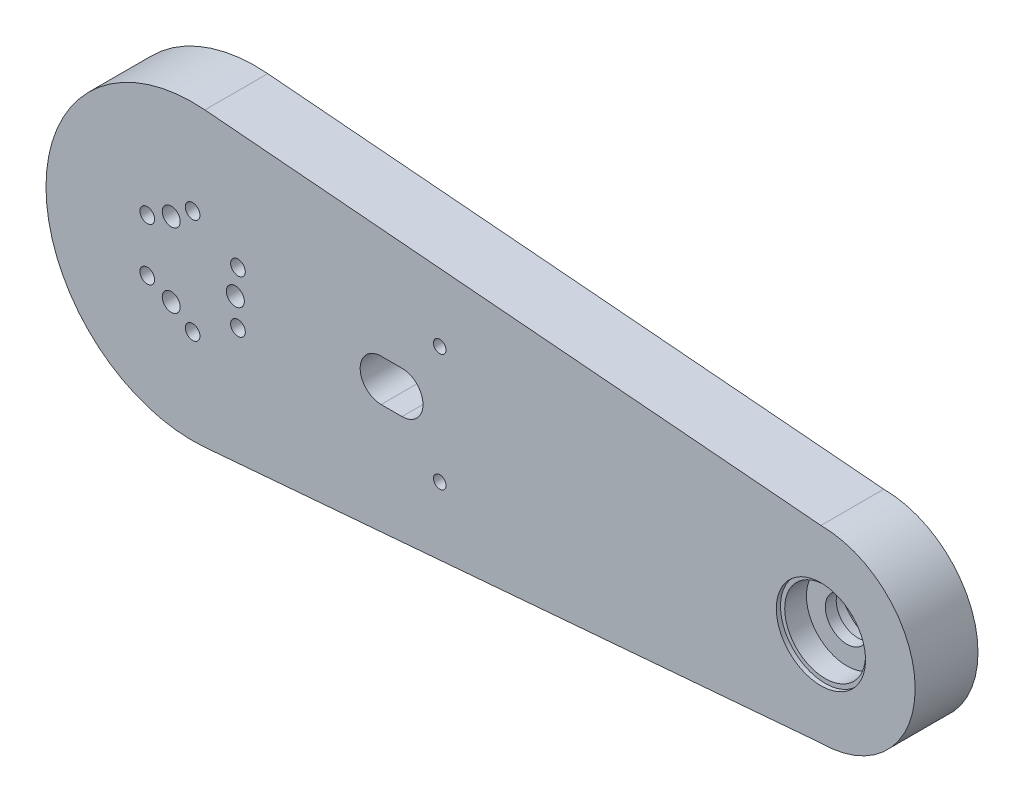
ISO-10303-21;
HEADER;
FILE_DESCRIPTION(('STEP AP214'),'2;1');
FILE_NAME('part.step','',(''),(''),'','','');
FILE_SCHEMA(('AUTOMOTIVE_DESIGN { 1 0 10303 214 1 1 1 1 }'));
ENDSEC;
DATA;
#1=APPLICATION_CONTEXT('core data for automotive mechanical design processes');
#2=APPLICATION_PROTOCOL_DEFINITION('international standard','automotive_design',2000,#1);
#3=PRODUCT_CONTEXT('',#1,'mechanical');
#4=PRODUCT('Part','Part','',(#3));
#5=PRODUCT_RELATED_PRODUCT_CATEGORY('part','',(#4));
#6=PRODUCT_DEFINITION_FORMATION('','',#4);
#7=PRODUCT_DEFINITION_CONTEXT('part definition',#1,'design');
#8=PRODUCT_DEFINITION('design','',#6,#7);
#9=PRODUCT_DEFINITION_SHAPE('','',#8);
#10=(LENGTH_UNIT() NAMED_UNIT(*) SI_UNIT(.MILLI.,.METRE.));
#11=(NAMED_UNIT(*) PLANE_ANGLE_UNIT() SI_UNIT($,.RADIAN.));
#12=(NAMED_UNIT(*) SI_UNIT($,.STERADIAN.) SOLID_ANGLE_UNIT());
#13=UNCERTAINTY_MEASURE_WITH_UNIT(LENGTH_MEASURE(1.E-05),#10,'distance_accuracy_value','');
#14=(GEOMETRIC_REPRESENTATION_CONTEXT(3) GLOBAL_UNCERTAINTY_ASSIGNED_CONTEXT((#13)) GLOBAL_UNIT_ASSIGNED_CONTEXT((#10,
#11,#12)) REPRESENTATION_CONTEXT('',''));
#15=CARTESIAN_POINT('',(0.,0.,0.));
#16=DIRECTION('',(0.,0.,1.));
#17=DIRECTION('',(1.,0.,0.));
#18=AXIS2_PLACEMENT_3D('',#15,#16,#17);
#19=CARTESIAN_POINT('',(150.,0.,15.));
#20=DIRECTION('',(0.,0.,1.));
#21=DIRECTION('',(1.,0.,0.));
#22=AXIS2_PLACEMENT_3D('',#19,#20,#21);
#23=PLANE('',#22);
#24=CARTESIAN_POINT('',(59.,14.,15.));
#25=DIRECTION('',(0.,0.,-1.));
#26=DIRECTION('',(-1.,0.,0.));
#27=AXIS2_PLACEMENT_3D('',#24,#25,#26);
#28=CIRCLE('',#27,1.50000000000002);
#29=CARTESIAN_POINT('',(57.5,14.,15.));
#30=VERTEX_POINT('',#29);
#31=EDGE_CURVE('E342',#30,#30,#28,.T.);
#32=ORIENTED_EDGE('',*,*,#31,.T.);
#33=EDGE_LOOP('',(#32));
#34=FACE_BOUND('',#33,.T.);
#35=CARTESIAN_POINT('',(59.,-14.,15.));
#36=DIRECTION('',(0.,0.,-1.));
#37=DIRECTION('',(-1.,0.,0.));
#38=AXIS2_PLACEMENT_3D('',#35,#36,#37);
#39=CIRCLE('',#38,1.50000000000002);
#40=CARTESIAN_POINT('',(57.5,-14.,15.));
#41=VERTEX_POINT('',#40);
#42=EDGE_CURVE('E352',#41,#41,#39,.T.);
#43=ORIENTED_EDGE('',*,*,#42,.T.);
#44=EDGE_LOOP('',(#43));
#45=FACE_BOUND('',#44,.T.);
#46=CARTESIAN_POINT('',(-10.82531754731,-6.25,15.));
#47=DIRECTION('',(0.,0.,-1.));
#48=DIRECTION('',(-1.,0.,0.));
#49=AXIS2_PLACEMENT_3D('',#46,#47,#48);
#50=CIRCLE('',#49,1.75000000000001);
#51=CARTESIAN_POINT('',(-12.57531754731,-6.25,15.));
#52=VERTEX_POINT('',#51);
#53=EDGE_CURVE('E364',#52,#52,#50,.T.);
#54=ORIENTED_EDGE('',*,*,#53,.T.);
#55=EDGE_LOOP('',(#54));
#56=FACE_BOUND('',#55,.T.);
#57=CARTESIAN_POINT('',(150.,0.,15.));
#58=DIRECTION('',(0.,0.,1.));
#59=DIRECTION('',(1.,0.,0.));
#60=AXIS2_PLACEMENT_3D('',#57,#58,#59);
#61=CIRCLE('',#60,22.5);
#62=CARTESIAN_POINT('',(150.,-22.5,15.));
#63=VERTEX_POINT('',#62);
#64=CARTESIAN_POINT('',(150.,22.5,15.));
#65=VERTEX_POINT('',#64);
#66=EDGE_CURVE('E135',#63,#65,#61,.T.);
#67=ORIENTED_EDGE('',*,*,#66,.T.);
#68=DIRECTION('',(-0.996477401346078,0.0838617231314042,0.));
#69=VECTOR('',#68,1.);
#70=CARTESIAN_POINT('',(150.,22.5,15.));
#71=LINE('',#70,#69);
#72=CARTESIAN_POINT('',(2.9351603096,34.87670904711,15.));
#73=VERTEX_POINT('',#72);
#74=EDGE_CURVE('E154',#65,#73,#71,.T.);
#75=ORIENTED_EDGE('',*,*,#74,.T.);
#76=CARTESIAN_POINT('',(0.,0.,15.));
#77=DIRECTION('',(0.,0.,1.));
#78=DIRECTION('',(1.,0.,0.));
#79=AXIS2_PLACEMENT_3D('',#76,#77,#78);
#80=CIRCLE('',#79,34.9999999999974);
#81=CARTESIAN_POINT('',(2.93516030959999,-34.87670904711,15.));
#82=VERTEX_POINT('',#81);
#83=EDGE_CURVE('E157',#73,#82,#80,.T.);
#84=ORIENTED_EDGE('',*,*,#83,.T.);
#85=DIRECTION('',(0.996477401346078,0.0838617231314042,0.));
#86=VECTOR('',#85,1.);
#87=CARTESIAN_POINT('',(2.9351603096,-34.87670904711,15.));
#88=LINE('',#87,#86);
#89=EDGE_CURVE('E143',#82,#63,#88,.T.);
#90=ORIENTED_EDGE('',*,*,#89,.T.);
#91=EDGE_LOOP('',(#67,#75,#84,#90));
#92=FACE_BOUND('',#91,.T.);
#93=CARTESIAN_POINT('',(45.,0.,15.));
#94=DIRECTION('',(0.,0.,-1.));
#95=DIRECTION('',(-1.,0.,0.));
#96=AXIS2_PLACEMENT_3D('',#93,#94,#95);
#97=CIRCLE('',#96,5.);
#98=CARTESIAN_POINT('',(45.,-5.,15.));
#99=VERTEX_POINT('',#98);
#100=CARTESIAN_POINT('',(45.,5.,15.));
#101=VERTEX_POINT('',#100);
#102=EDGE_CURVE('E102',#99,#101,#97,.T.);
#103=ORIENTED_EDGE('',*,*,#102,.T.);
#104=DIRECTION('',(1.,0.,0.));
#105=VECTOR('',#104,1.);
#106=CARTESIAN_POINT('',(45.,5.,15.));
#107=LINE('',#106,#105);
#108=CARTESIAN_POINT('',(50.,5.,15.));
#109=VERTEX_POINT('',#108);
#110=EDGE_CURVE('E111',#101,#109,#107,.T.);
#111=ORIENTED_EDGE('',*,*,#110,.T.);
#112=CARTESIAN_POINT('',(50.,0.,15.));
#113=DIRECTION('',(0.,0.,-1.));
#114=DIRECTION('',(-1.,0.,0.));
#115=AXIS2_PLACEMENT_3D('',#112,#113,#114);
#116=CIRCLE('',#115,5.);
#117=CARTESIAN_POINT('',(50.,-5.,15.));
#118=VERTEX_POINT('',#117);
#119=EDGE_CURVE('E59',#109,#118,#116,.T.);
#120=ORIENTED_EDGE('',*,*,#119,.T.);
#121=DIRECTION('',(-1.,0.,0.));
#122=VECTOR('',#121,1.);
#123=CARTESIAN_POINT('',(50.,-5.,15.));
#124=LINE('',#123,#122);
#125=EDGE_CURVE('E108',#118,#99,#124,.T.);
#126=ORIENTED_EDGE('',*,*,#125,.T.);
#127=EDGE_LOOP('',(#103,#111,#120,#126));
#128=FACE_BOUND('',#127,.T.);
#129=CARTESIAN_POINT('',(150.,0.,15.));
#130=DIRECTION('',(0.,0.,-1.));
#131=DIRECTION('',(-1.,0.,0.));
#132=AXIS2_PLACEMENT_3D('',#129,#130,#131);
#133=CIRCLE('',#132,10.65);
#134=CARTESIAN_POINT('',(139.35,0.,15.));
#135=VERTEX_POINT('',#134);
#136=EDGE_CURVE('E123',#135,#135,#133,.T.);
#137=ORIENTED_EDGE('',*,*,#136,.T.);
#138=EDGE_LOOP('',(#137));
#139=FACE_BOUND('',#138,.T.);
#140=CARTESIAN_POINT('',(-5.1,8.833459118601,15.));
#141=DIRECTION('',(0.,0.,-1.));
#142=DIRECTION('',(-1.,0.,0.));
#143=AXIS2_PLACEMENT_3D('',#140,#141,#142);
#144=CIRCLE('',#143,2.15000000000001);
#145=CARTESIAN_POINT('',(-7.25000000000001,8.833459118601,15.));
#146=VERTEX_POINT('',#145);
#147=EDGE_CURVE('E442',#146,#146,#144,.T.);
#148=ORIENTED_EDGE('',*,*,#147,.T.);
#149=EDGE_LOOP('',(#148));
#150=FACE_BOUND('',#149,.T.);
#151=CARTESIAN_POINT('',(-5.1,-8.833459118601,15.));
#152=DIRECTION('',(0.,0.,-1.));
#153=DIRECTION('',(-1.,0.,0.));
#154=AXIS2_PLACEMENT_3D('',#151,#152,#153);
#155=CIRCLE('',#154,2.15000000000001);
#156=CARTESIAN_POINT('',(-7.25000000000001,-8.833459118601,15.));
#157=VERTEX_POINT('',#156);
#158=EDGE_CURVE('E436',#157,#157,#155,.T.);
#159=ORIENTED_EDGE('',*,*,#158,.T.);
#160=EDGE_LOOP('',(#159));
#161=FACE_BOUND('',#160,.T.);
#162=CARTESIAN_POINT('',(10.2,0.,15.));
#163=DIRECTION('',(0.,0.,-1.));
#164=DIRECTION('',(-1.,0.,0.));
#165=AXIS2_PLACEMENT_3D('',#162,#163,#164);
#166=CIRCLE('',#165,2.15000000000001);
#167=CARTESIAN_POINT('',(8.04999999999999,0.,15.));
#168=VERTEX_POINT('',#167);
#169=EDGE_CURVE('E430',#168,#168,#166,.T.);
#170=ORIENTED_EDGE('',*,*,#169,.T.);
#171=EDGE_LOOP('',(#170));
#172=FACE_BOUND('',#171,.T.);
#173=CARTESIAN_POINT('',(-10.82531754731,6.25,15.));
#174=DIRECTION('',(0.,0.,-1.));
#175=DIRECTION('',(-1.,0.,0.));
#176=AXIS2_PLACEMENT_3D('',#173,#174,#175);
#177=CIRCLE('',#176,1.75000000000001);
#178=CARTESIAN_POINT('',(-12.57531754731,6.25,15.));
#179=VERTEX_POINT('',#178);
#180=EDGE_CURVE('E424',#179,#179,#177,.T.);
#181=ORIENTED_EDGE('',*,*,#180,.T.);
#182=EDGE_LOOP('',(#181));
#183=FACE_BOUND('',#182,.T.);
#184=CARTESIAN_POINT('',(0.,12.5,15.));
#185=DIRECTION('',(0.,0.,-1.));
#186=DIRECTION('',(-1.,0.,0.));
#187=AXIS2_PLACEMENT_3D('',#184,#185,#186);
#188=CIRCLE('',#187,1.75000000000001);
#189=CARTESIAN_POINT('',(-1.75000000000001,12.5,15.));
#190=VERTEX_POINT('',#189);
#191=EDGE_CURVE('E412',#190,#190,#188,.T.);
#192=ORIENTED_EDGE('',*,*,#191,.T.);
#193=EDGE_LOOP('',(#192));
#194=FACE_BOUND('',#193,.T.);
#195=CARTESIAN_POINT('',(10.82531754731,6.25,15.));
#196=DIRECTION('',(0.,0.,-1.));
#197=DIRECTION('',(-1.,0.,0.));
#198=AXIS2_PLACEMENT_3D('',#195,#196,#197);
#199=CIRCLE('',#198,1.75000000000001);
#200=CARTESIAN_POINT('',(9.07531754730999,6.25,15.));
#201=VERTEX_POINT('',#200);
#202=EDGE_CURVE('E400',#201,#201,#199,.T.);
#203=ORIENTED_EDGE('',*,*,#202,.T.);
#204=EDGE_LOOP('',(#203));
#205=FACE_BOUND('',#204,.T.);
#206=CARTESIAN_POINT('',(10.82531754731,-6.25,15.));
#207=DIRECTION('',(0.,0.,-1.));
#208=DIRECTION('',(-1.,0.,0.));
#209=AXIS2_PLACEMENT_3D('',#206,#207,#208);
#210=CIRCLE('',#209,1.75000000000001);
#211=CARTESIAN_POINT('',(9.07531754730999,-6.25,15.));
#212=VERTEX_POINT('',#211);
#213=EDGE_CURVE('E388',#212,#212,#210,.T.);
#214=ORIENTED_EDGE('',*,*,#213,.T.);
#215=EDGE_LOOP('',(#214));
#216=FACE_BOUND('',#215,.T.);
#217=CARTESIAN_POINT('',(0.,-12.5,15.));
#218=DIRECTION('',(0.,0.,-1.));
#219=DIRECTION('',(-1.,0.,0.));
#220=AXIS2_PLACEMENT_3D('',#217,#218,#219);
#221=CIRCLE('',#220,1.75000000000001);
#222=CARTESIAN_POINT('',(-1.75000000000001,-12.5,15.));
#223=VERTEX_POINT('',#222);
#224=EDGE_CURVE('E376',#223,#223,#221,.T.);
#225=ORIENTED_EDGE('',*,*,#224,.T.);
#226=EDGE_LOOP('',(#225));
#227=FACE_BOUND('',#226,.T.);
#228=ADVANCED_FACE('F34',(#34,#45,#56,#92,#128,#139,#150,#161,#172,#183,#194,#205,#216,#227),
#23,.T.);
#229=CARTESIAN_POINT('',(150.,0.,0.));
#230=DIRECTION('',(0.,0.,1.));
#231=DIRECTION('',(1.,0.,0.));
#232=AXIS2_PLACEMENT_3D('',#229,#230,#231);
#233=PLANE('',#232);
#234=CARTESIAN_POINT('',(59.,14.,0.));
#235=DIRECTION('',(0.,0.,-1.));
#236=DIRECTION('',(-1.,0.,0.));
#237=AXIS2_PLACEMENT_3D('',#234,#235,#236);
#238=CIRCLE('',#237,1.50000000000002);
#239=CARTESIAN_POINT('',(57.5,14.,0.));
#240=VERTEX_POINT('',#239);
#241=EDGE_CURVE('E345',#240,#240,#238,.T.);
#242=ORIENTED_EDGE('',*,*,#241,.F.);
#243=EDGE_LOOP('',(#242));
#244=FACE_BOUND('',#243,.T.);
#245=CARTESIAN_POINT('',(59.,-14.,0.));
#246=DIRECTION('',(0.,0.,-1.));
#247=DIRECTION('',(-1.,0.,0.));
#248=AXIS2_PLACEMENT_3D('',#245,#246,#247);
#249=CIRCLE('',#248,1.50000000000002);
#250=CARTESIAN_POINT('',(57.5,-14.,0.));
#251=VERTEX_POINT('',#250);
#252=EDGE_CURVE('E347',#251,#251,#249,.T.);
#253=ORIENTED_EDGE('',*,*,#252,.F.);
#254=EDGE_LOOP('',(#253));
#255=FACE_BOUND('',#254,.T.);
#256=CARTESIAN_POINT('',(-10.82531754731,-6.25,0.));
#257=DIRECTION('',(0.,0.,-1.));
#258=DIRECTION('',(-1.,0.,0.));
#259=AXIS2_PLACEMENT_3D('',#256,#257,#258);
#260=CIRCLE('',#259,3.25000000000001);
#261=CARTESIAN_POINT('',(-14.07531754731,-6.25,0.));
#262=VERTEX_POINT('',#261);
#263=EDGE_CURVE('E355',#262,#262,#260,.T.);
#264=ORIENTED_EDGE('',*,*,#263,.F.);
#265=EDGE_LOOP('',(#264));
#266=FACE_BOUND('',#265,.T.);
#267=CARTESIAN_POINT('',(10.82531754731,6.25,0.));
#268=DIRECTION('',(0.,0.,-1.));
#269=DIRECTION('',(-1.,0.,0.));
#270=AXIS2_PLACEMENT_3D('',#267,#268,#269);
#271=CIRCLE('',#270,3.25000000000001);
#272=CARTESIAN_POINT('',(7.57531754730999,6.25,0.));
#273=VERTEX_POINT('',#272);
#274=EDGE_CURVE('E391',#273,#273,#271,.T.);
#275=ORIENTED_EDGE('',*,*,#274,.F.);
#276=EDGE_LOOP('',(#275));
#277=FACE_BOUND('',#276,.T.);
#278=CARTESIAN_POINT('',(-10.82531754731,6.25,0.));
#279=DIRECTION('',(0.,0.,-1.));
#280=DIRECTION('',(-1.,0.,0.));
#281=AXIS2_PLACEMENT_3D('',#278,#279,#280);
#282=CIRCLE('',#281,3.25000000000001);
#283=CARTESIAN_POINT('',(-14.07531754731,6.25,0.));
#284=VERTEX_POINT('',#283);
#285=EDGE_CURVE('E415',#284,#284,#282,.T.);
#286=ORIENTED_EDGE('',*,*,#285,.F.);
#287=EDGE_LOOP('',(#286));
#288=FACE_BOUND('',#287,.T.);
#289=CARTESIAN_POINT('',(10.2,0.,0.));
#290=DIRECTION('',(0.,0.,-1.));
#291=DIRECTION('',(-1.,0.,0.));
#292=AXIS2_PLACEMENT_3D('',#289,#290,#291);
#293=CIRCLE('',#292,2.15000000000001);
#294=CARTESIAN_POINT('',(8.04999999999999,0.,0.));
#295=VERTEX_POINT('',#294);
#296=EDGE_CURVE('E427',#295,#295,#293,.T.);
#297=ORIENTED_EDGE('',*,*,#296,.F.);
#298=EDGE_LOOP('',(#297));
#299=FACE_BOUND('',#298,.T.);
#300=CARTESIAN_POINT('',(-5.1,-8.833459118601,0.));
#301=DIRECTION('',(0.,0.,-1.));
#302=DIRECTION('',(-1.,0.,0.));
#303=AXIS2_PLACEMENT_3D('',#300,#301,#302);
#304=CIRCLE('',#303,2.15000000000001);
#305=CARTESIAN_POINT('',(-7.25000000000002,-8.833459118601,0.));
#306=VERTEX_POINT('',#305);
#307=EDGE_CURVE('E433',#306,#306,#304,.T.);
#308=ORIENTED_EDGE('',*,*,#307,.F.);
#309=EDGE_LOOP('',(#308));
#310=FACE_BOUND('',#309,.T.);
#311=CARTESIAN_POINT('',(-5.1,8.833459118601,0.));
#312=DIRECTION('',(0.,0.,-1.));
#313=DIRECTION('',(-1.,0.,0.));
#314=AXIS2_PLACEMENT_3D('',#311,#312,#313);
#315=CIRCLE('',#314,2.15000000000001);
#316=CARTESIAN_POINT('',(-7.25000000000002,8.833459118601,0.));
#317=VERTEX_POINT('',#316);
#318=EDGE_CURVE('E439',#317,#317,#315,.T.);
#319=ORIENTED_EDGE('',*,*,#318,.F.);
#320=EDGE_LOOP('',(#319));
#321=FACE_BOUND('',#320,.T.);
#322=CARTESIAN_POINT('',(150.,0.,0.));
#323=DIRECTION('',(0.,0.,-1.));
#324=DIRECTION('',(-1.,0.,0.));
#325=AXIS2_PLACEMENT_3D('',#322,#323,#324);
#326=CIRCLE('',#325,10.65);
#327=CARTESIAN_POINT('',(139.35,0.,0.));
#328=VERTEX_POINT('',#327);
#329=EDGE_CURVE('E468',#328,#328,#326,.T.);
#330=ORIENTED_EDGE('',*,*,#329,.F.);
#331=EDGE_LOOP('',(#330));
#332=FACE_BOUND('',#331,.T.);
#333=DIRECTION('',(1.,0.,0.));
#334=VECTOR('',#333,1.);
#335=CARTESIAN_POINT('',(45.,5.,0.));
#336=LINE('',#335,#334);
#337=CARTESIAN_POINT('',(45.,5.,0.));
#338=VERTEX_POINT('',#337);
#339=CARTESIAN_POINT('',(50.,5.,0.));
#340=VERTEX_POINT('',#339);
#341=EDGE_CURVE('E129',#338,#340,#336,.T.);
#342=ORIENTED_EDGE('',*,*,#341,.F.);
#343=CARTESIAN_POINT('',(45.,0.,0.));
#344=DIRECTION('',(0.,0.,-1.));
#345=DIRECTION('',(-1.,0.,0.));
#346=AXIS2_PLACEMENT_3D('',#343,#344,#345);
#347=CIRCLE('',#346,5.);
#348=CARTESIAN_POINT('',(45.,-5.,0.));
#349=VERTEX_POINT('',#348);
#350=EDGE_CURVE('E51',#349,#338,#347,.T.);
#351=ORIENTED_EDGE('',*,*,#350,.F.);
#352=DIRECTION('',(-1.,0.,0.));
#353=VECTOR('',#352,1.);
#354=CARTESIAN_POINT('',(50.,-5.,0.));
#355=LINE('',#354,#353);
#356=CARTESIAN_POINT('',(50.,-5.,0.));
#357=VERTEX_POINT('',#356);
#358=EDGE_CURVE('E117',#357,#349,#355,.T.);
#359=ORIENTED_EDGE('',*,*,#358,.F.);
#360=CARTESIAN_POINT('',(50.,0.,0.));
#361=DIRECTION('',(0.,0.,-1.));
#362=DIRECTION('',(-1.,0.,0.));
#363=AXIS2_PLACEMENT_3D('',#360,#361,#362);
#364=CIRCLE('',#363,5.);
#365=EDGE_CURVE('E120',#340,#357,#364,.T.);
#366=ORIENTED_EDGE('',*,*,#365,.F.);
#367=EDGE_LOOP('',(#342,#351,#359,#366));
#368=FACE_BOUND('',#367,.T.);
#369=CARTESIAN_POINT('',(150.,0.,0.));
#370=DIRECTION('',(0.,0.,1.));
#371=DIRECTION('',(1.,0.,0.));
#372=AXIS2_PLACEMENT_3D('',#369,#370,#371);
#373=CIRCLE('',#372,22.5);
#374=CARTESIAN_POINT('',(150.,-22.5,0.));
#375=VERTEX_POINT('',#374);
#376=CARTESIAN_POINT('',(150.,22.5,0.));
#377=VERTEX_POINT('',#376);
#378=EDGE_CURVE('E139',#375,#377,#373,.T.);
#379=ORIENTED_EDGE('',*,*,#378,.F.);
#380=DIRECTION('',(0.996477401346078,0.0838617231314042,0.));
#381=VECTOR('',#380,1.);
#382=CARTESIAN_POINT('',(2.9351603096,-34.87670904711,0.));
#383=LINE('',#382,#381);
#384=CARTESIAN_POINT('',(2.93516030959999,-34.87670904711,0.));
#385=VERTEX_POINT('',#384);
#386=EDGE_CURVE('E149',#385,#375,#383,.T.);
#387=ORIENTED_EDGE('',*,*,#386,.F.);
#388=CARTESIAN_POINT('',(0.,0.,0.));
#389=DIRECTION('',(0.,0.,1.));
#390=DIRECTION('',(1.,0.,0.));
#391=AXIS2_PLACEMENT_3D('',#388,#389,#390);
#392=CIRCLE('',#391,34.9999999999974);
#393=CARTESIAN_POINT('',(2.9351603096,34.87670904711,0.));
#394=VERTEX_POINT('',#393);
#395=EDGE_CURVE('E146',#394,#385,#392,.T.);
#396=ORIENTED_EDGE('',*,*,#395,.F.);
#397=DIRECTION('',(-0.996477401346078,0.0838617231314042,0.));
#398=VECTOR('',#397,1.);
#399=CARTESIAN_POINT('',(150.,22.5,0.));
#400=LINE('',#399,#398);
#401=EDGE_CURVE('E142',#377,#394,#400,.T.);
#402=ORIENTED_EDGE('',*,*,#401,.F.);
#403=EDGE_LOOP('',(#379,#387,#396,#402));
#404=FACE_BOUND('',#403,.T.);
#405=CARTESIAN_POINT('',(0.,12.5,0.));
#406=DIRECTION('',(0.,0.,-1.));
#407=DIRECTION('',(-1.,0.,0.));
#408=AXIS2_PLACEMENT_3D('',#405,#406,#407);
#409=CIRCLE('',#408,3.25000000000001);
#410=CARTESIAN_POINT('',(-3.25000000000001,12.5,0.));
#411=VERTEX_POINT('',#410);
#412=EDGE_CURVE('E403',#411,#411,#409,.T.);
#413=ORIENTED_EDGE('',*,*,#412,.F.);
#414=EDGE_LOOP('',(#413));
#415=FACE_BOUND('',#414,.T.);
#416=CARTESIAN_POINT('',(10.82531754731,-6.25,0.));
#417=DIRECTION('',(0.,0.,-1.));
#418=DIRECTION('',(-1.,0.,0.));
#419=AXIS2_PLACEMENT_3D('',#416,#417,#418);
#420=CIRCLE('',#419,3.25000000000001);
#421=CARTESIAN_POINT('',(7.57531754730999,-6.25,0.));
#422=VERTEX_POINT('',#421);
#423=EDGE_CURVE('E379',#422,#422,#420,.T.);
#424=ORIENTED_EDGE('',*,*,#423,.F.);
#425=EDGE_LOOP('',(#424));
#426=FACE_BOUND('',#425,.T.);
#427=CARTESIAN_POINT('',(0.,-12.5,0.));
#428=DIRECTION('',(0.,0.,-1.));
#429=DIRECTION('',(-1.,0.,0.));
#430=AXIS2_PLACEMENT_3D('',#427,#428,#429);
#431=CIRCLE('',#430,3.25000000000001);
#432=CARTESIAN_POINT('',(-3.25000000000001,-12.5,0.));
#433=VERTEX_POINT('',#432);
#434=EDGE_CURVE('E367',#433,#433,#431,.T.);
#435=ORIENTED_EDGE('',*,*,#434,.F.);
#436=EDGE_LOOP('',(#435));
#437=FACE_BOUND('',#436,.T.);
#438=ADVANCED_FACE('F177',(#244,#255,#266,#277,#288,#299,#310,#321,#332,#368,#404,#415,#426,
#437),#233,.F.);
#439=CARTESIAN_POINT('',(150.,0.,0.));
#440=DIRECTION('',(0.,0.,1.));
#441=DIRECTION('',(1.,0.,0.));
#442=AXIS2_PLACEMENT_3D('',#439,#440,#441);
#443=CYLINDRICAL_SURFACE('',#442,22.5);
#444=ORIENTED_EDGE('',*,*,#66,.F.);
#445=DIRECTION('',(0.,0.,1.));
#446=VECTOR('',#445,1.);
#447=CARTESIAN_POINT('',(150.,-22.5,0.));
#448=LINE('',#447,#446);
#449=EDGE_CURVE('E11',#375,#63,#448,.T.);
#450=ORIENTED_EDGE('',*,*,#449,.F.);
#451=ORIENTED_EDGE('',*,*,#378,.T.);
#452=DIRECTION('',(0.,0.,1.));
#453=VECTOR('',#452,1.);
#454=CARTESIAN_POINT('',(150.,22.5,0.));
#455=LINE('',#454,#453);
#456=EDGE_CURVE('E38',#377,#65,#455,.T.);
#457=ORIENTED_EDGE('',*,*,#456,.T.);
#458=EDGE_LOOP('',(#444,#450,#451,#457));
#459=FACE_BOUND('',#458,.T.);
#460=ADVANCED_FACE('F36',(#459),#443,.T.);
#461=CARTESIAN_POINT('',(2.9351603096,-34.87670904711,0.));
#462=DIRECTION('',(0.0838617231314042,-0.996477401346077,0.));
#463=DIRECTION('',(0.996477401346078,0.0838617231314042,0.));
#464=AXIS2_PLACEMENT_3D('',#461,#462,#463);
#465=PLANE('',#464);
#466=ORIENTED_EDGE('',*,*,#89,.F.);
#467=DIRECTION('',(0.,0.,1.));
#468=VECTOR('',#467,1.);
#469=CARTESIAN_POINT('',(2.93516030959999,-34.87670904711,0.));
#470=LINE('',#469,#468);
#471=EDGE_CURVE('E43',#385,#82,#470,.T.);
#472=ORIENTED_EDGE('',*,*,#471,.F.);
#473=ORIENTED_EDGE('',*,*,#386,.T.);
#474=ORIENTED_EDGE('',*,*,#449,.T.);
#475=EDGE_LOOP('',(#466,#472,#473,#474));
#476=FACE_BOUND('',#475,.T.);
#477=ADVANCED_FACE('F174',(#476),#465,.T.);
#478=CARTESIAN_POINT('',(0.,0.,0.));
#479=DIRECTION('',(0.,0.,1.));
#480=DIRECTION('',(1.,0.,0.));
#481=AXIS2_PLACEMENT_3D('',#478,#479,#480);
#482=CYLINDRICAL_SURFACE('',#481,34.9999999999974);
#483=ORIENTED_EDGE('',*,*,#83,.F.);
#484=DIRECTION('',(0.,0.,1.));
#485=VECTOR('',#484,1.);
#486=CARTESIAN_POINT('',(2.9351603096,34.87670904711,0.));
#487=LINE('',#486,#485);
#488=EDGE_CURVE('E162',#394,#73,#487,.T.);
#489=ORIENTED_EDGE('',*,*,#488,.F.);
#490=ORIENTED_EDGE('',*,*,#395,.T.);
#491=ORIENTED_EDGE('',*,*,#471,.T.);
#492=EDGE_LOOP('',(#483,#489,#490,#491));
#493=FACE_BOUND('',#492,.T.);
#494=ADVANCED_FACE('F181',(#493),#482,.T.);
#495=CARTESIAN_POINT('',(150.,22.5,0.));
#496=DIRECTION('',(0.0838617231314042,0.996477401346077,0.));
#497=DIRECTION('',(-0.996477401346078,0.0838617231314042,0.));
#498=AXIS2_PLACEMENT_3D('',#495,#496,#497);
#499=PLANE('',#498);
#500=ORIENTED_EDGE('',*,*,#74,.F.);
#501=ORIENTED_EDGE('',*,*,#456,.F.);
#502=ORIENTED_EDGE('',*,*,#401,.T.);
#503=ORIENTED_EDGE('',*,*,#488,.T.);
#504=EDGE_LOOP('',(#500,#501,#502,#503));
#505=FACE_BOUND('',#504,.T.);
#506=ADVANCED_FACE('F170',(#505),#499,.T.);
#507=CARTESIAN_POINT('',(45.,0.,15.));
#508=DIRECTION('',(0.,0.,-1.));
#509=DIRECTION('',(-1.,0.,0.));
#510=AXIS2_PLACEMENT_3D('',#507,#508,#509);
#511=CYLINDRICAL_SURFACE('',#510,5.);
#512=ORIENTED_EDGE('',*,*,#350,.T.);
#513=DIRECTION('',(0.,0.,-1.));
#514=VECTOR('',#513,1.);
#515=CARTESIAN_POINT('',(45.,5.,15.));
#516=LINE('',#515,#514);
#517=EDGE_CURVE('E98',#101,#338,#516,.T.);
#518=ORIENTED_EDGE('',*,*,#517,.F.);
#519=ORIENTED_EDGE('',*,*,#102,.F.);
#520=DIRECTION('',(0.,0.,-1.));
#521=VECTOR('',#520,1.);
#522=CARTESIAN_POINT('',(45.,-5.,15.));
#523=LINE('',#522,#521);
#524=EDGE_CURVE('E133',#99,#349,#523,.T.);
#525=ORIENTED_EDGE('',*,*,#524,.T.);
#526=EDGE_LOOP('',(#512,#518,#519,#525));
#527=FACE_BOUND('',#526,.T.);
#528=ADVANCED_FACE('F100',(#527),#511,.F.);
#529=CARTESIAN_POINT('',(50.,-5.,15.));
#530=DIRECTION('',(0.,-1.,0.));
#531=DIRECTION('',(0.,0.,-1.));
#532=AXIS2_PLACEMENT_3D('',#529,#530,#531);
#533=PLANE('',#532);
#534=ORIENTED_EDGE('',*,*,#358,.T.);
#535=ORIENTED_EDGE('',*,*,#524,.F.);
#536=ORIENTED_EDGE('',*,*,#125,.F.);
#537=DIRECTION('',(0.,0.,-1.));
#538=VECTOR('',#537,1.);
#539=CARTESIAN_POINT('',(50.,-5.,15.));
#540=LINE('',#539,#538);
#541=EDGE_CURVE('E136',#118,#357,#540,.T.);
#542=ORIENTED_EDGE('',*,*,#541,.T.);
#543=EDGE_LOOP('',(#534,#535,#536,#542));
#544=FACE_BOUND('',#543,.T.);
#545=ADVANCED_FACE('F202',(#544),#533,.F.);
#546=CARTESIAN_POINT('',(50.,0.,15.));
#547=DIRECTION('',(0.,0.,-1.));
#548=DIRECTION('',(-1.,0.,0.));
#549=AXIS2_PLACEMENT_3D('',#546,#547,#548);
#550=CYLINDRICAL_SURFACE('',#549,5.);
#551=ORIENTED_EDGE('',*,*,#365,.T.);
#552=ORIENTED_EDGE('',*,*,#541,.F.);
#553=ORIENTED_EDGE('',*,*,#119,.F.);
#554=DIRECTION('',(0.,0.,-1.));
#555=VECTOR('',#554,1.);
#556=CARTESIAN_POINT('',(50.,5.,15.));
#557=LINE('',#556,#555);
#558=EDGE_CURVE('E107',#109,#340,#557,.T.);
#559=ORIENTED_EDGE('',*,*,#558,.T.);
#560=EDGE_LOOP('',(#551,#552,#553,#559));
#561=FACE_BOUND('',#560,.T.);
#562=ADVANCED_FACE('F206',(#561),#550,.F.);
#563=CARTESIAN_POINT('',(45.,5.,15.));
#564=DIRECTION('',(0.,1.,0.));
#565=DIRECTION('',(0.,0.,1.));
#566=AXIS2_PLACEMENT_3D('',#563,#564,#565);
#567=PLANE('',#566);
#568=ORIENTED_EDGE('',*,*,#341,.T.);
#569=ORIENTED_EDGE('',*,*,#558,.F.);
#570=ORIENTED_EDGE('',*,*,#110,.F.);
#571=ORIENTED_EDGE('',*,*,#517,.T.);
#572=EDGE_LOOP('',(#568,#569,#570,#571));
#573=FACE_BOUND('',#572,.T.);
#574=ADVANCED_FACE('F112',(#573),#567,.F.);
#575=CARTESIAN_POINT('',(150.,0.,15.));
#576=DIRECTION('',(0.,0.,-1.));
#577=DIRECTION('',(-1.,0.,0.));
#578=AXIS2_PLACEMENT_3D('',#575,#576,#577);
#579=CYLINDRICAL_SURFACE('',#578,10.65);
#580=ORIENTED_EDGE('',*,*,#136,.F.);
#581=EDGE_LOOP('',(#580));
#582=FACE_BOUND('',#581,.T.);
#583=CARTESIAN_POINT('',(150.,0.,14.));
#584=DIRECTION('',(0.,0.,-1.));
#585=DIRECTION('',(-1.,0.,0.));
#586=AXIS2_PLACEMENT_3D('',#583,#584,#585);
#587=CIRCLE('',#586,10.65);
#588=CARTESIAN_POINT('',(139.35,0.,14.));
#589=VERTEX_POINT('',#588);
#590=EDGE_CURVE('E445',#589,#589,#587,.T.);
#591=ORIENTED_EDGE('',*,*,#590,.T.);
#592=EDGE_LOOP('',(#591));
#593=FACE_BOUND('',#592,.T.);
#594=ADVANCED_FACE('F205',(#582,#593),#579,.F.);
#595=CARTESIAN_POINT('',(150.,0.,15.));
#596=DIRECTION('',(0.,0.,-1.));
#597=DIRECTION('',(-1.,0.,0.));
#598=AXIS2_PLACEMENT_3D('',#595,#596,#597);
#599=CYLINDRICAL_SURFACE('',#598,10.65);
#600=CARTESIAN_POINT('',(150.,0.,1.));
#601=DIRECTION('',(0.,0.,-1.));
#602=DIRECTION('',(-1.,0.,0.));
#603=AXIS2_PLACEMENT_3D('',#600,#601,#602);
#604=CIRCLE('',#603,10.65);
#605=CARTESIAN_POINT('',(139.35,0.,1.));
#606=VERTEX_POINT('',#605);
#607=EDGE_CURVE('E466',#606,#606,#604,.T.);
#608=ORIENTED_EDGE('',*,*,#607,.F.);
#609=EDGE_LOOP('',(#608));
#610=FACE_BOUND('',#609,.T.);
#611=ORIENTED_EDGE('',*,*,#329,.T.);
#612=EDGE_LOOP('',(#611));
#613=FACE_BOUND('',#612,.T.);
#614=ADVANCED_FACE('F214',(#610,#613),#599,.F.);
#615=CARTESIAN_POINT('',(160.65,0.,1.));
#616=DIRECTION('',(0.,0.,1.));
#617=DIRECTION('',(1.,0.,0.));
#618=AXIS2_PLACEMENT_3D('',#615,#616,#617);
#619=PLANE('',#618);
#620=CARTESIAN_POINT('',(150.,0.,1.));
#621=DIRECTION('',(0.,0.,-1.));
#622=DIRECTION('',(-1.,0.,0.));
#623=AXIS2_PLACEMENT_3D('',#620,#621,#622);
#624=CIRCLE('',#623,9.64999999999999);
#625=CARTESIAN_POINT('',(140.35,0.,1.));
#626=VERTEX_POINT('',#625);
#627=EDGE_CURVE('E463',#626,#626,#624,.T.);
#628=ORIENTED_EDGE('',*,*,#627,.F.);
#629=EDGE_LOOP('',(#628));
#630=FACE_BOUND('',#629,.T.);
#631=ORIENTED_EDGE('',*,*,#607,.T.);
#632=EDGE_LOOP('',(#631));
#633=FACE_BOUND('',#632,.T.);
#634=ADVANCED_FACE('F218',(#630,#633),#619,.F.);
#635=CARTESIAN_POINT('',(150.,0.,15.));
#636=DIRECTION('',(0.,0.,-1.));
#637=DIRECTION('',(-1.,0.,0.));
#638=AXIS2_PLACEMENT_3D('',#635,#636,#637);
#639=CYLINDRICAL_SURFACE('',#638,9.64999999999999);
#640=CARTESIAN_POINT('',(150.,0.,6.2));
#641=DIRECTION('',(0.,0.,-1.));
#642=DIRECTION('',(-1.,0.,0.));
#643=AXIS2_PLACEMENT_3D('',#640,#641,#642);
#644=CIRCLE('',#643,9.64999999999999);
#645=CARTESIAN_POINT('',(140.35,0.,6.2));
#646=VERTEX_POINT('',#645);
#647=EDGE_CURVE('E460',#646,#646,#644,.T.);
#648=ORIENTED_EDGE('',*,*,#647,.F.);
#649=EDGE_LOOP('',(#648));
#650=FACE_BOUND('',#649,.T.);
#651=ORIENTED_EDGE('',*,*,#627,.T.);
#652=EDGE_LOOP('',(#651));
#653=FACE_BOUND('',#652,.T.);
#654=ADVANCED_FACE('F222',(#650,#653),#639,.F.);
#655=CARTESIAN_POINT('',(159.65,0.,6.2));
#656=DIRECTION('',(0.,0.,1.));
#657=DIRECTION('',(1.,0.,0.));
#658=AXIS2_PLACEMENT_3D('',#655,#656,#657);
#659=PLANE('',#658);
#660=CARTESIAN_POINT('',(150.,0.,6.2));
#661=DIRECTION('',(0.,0.,-1.));
#662=DIRECTION('',(-1.,0.,0.));
#663=AXIS2_PLACEMENT_3D('',#660,#661,#662);
#664=CIRCLE('',#663,5.14999999999999);
#665=CARTESIAN_POINT('',(144.85,0.,6.2));
#666=VERTEX_POINT('',#665);
#667=EDGE_CURVE('E457',#666,#666,#664,.T.);
#668=ORIENTED_EDGE('',*,*,#667,.F.);
#669=EDGE_LOOP('',(#668));
#670=FACE_BOUND('',#669,.T.);
#671=ORIENTED_EDGE('',*,*,#647,.T.);
#672=EDGE_LOOP('',(#671));
#673=FACE_BOUND('',#672,.T.);
#674=ADVANCED_FACE('F226',(#670,#673),#659,.F.);
#675=CARTESIAN_POINT('',(150.,0.,15.));
#676=DIRECTION('',(0.,0.,-1.));
#677=DIRECTION('',(-1.,0.,0.));
#678=AXIS2_PLACEMENT_3D('',#675,#676,#677);
#679=CYLINDRICAL_SURFACE('',#678,5.14999999999999);
#680=CARTESIAN_POINT('',(150.,0.,8.8));
#681=DIRECTION('',(0.,0.,-1.));
#682=DIRECTION('',(-1.,0.,0.));
#683=AXIS2_PLACEMENT_3D('',#680,#681,#682);
#684=CIRCLE('',#683,5.14999999999999);
#685=CARTESIAN_POINT('',(144.85,0.,8.8));
#686=VERTEX_POINT('',#685);
#687=EDGE_CURVE('E454',#686,#686,#684,.T.);
#688=ORIENTED_EDGE('',*,*,#687,.F.);
#689=EDGE_LOOP('',(#688));
#690=FACE_BOUND('',#689,.T.);
#691=ORIENTED_EDGE('',*,*,#667,.T.);
#692=EDGE_LOOP('',(#691));
#693=FACE_BOUND('',#692,.T.);
#694=ADVANCED_FACE('F230',(#690,#693),#679,.F.);
#695=CARTESIAN_POINT('',(155.15,0.,8.8));
#696=DIRECTION('',(0.,0.,-1.));
#697=DIRECTION('',(-1.,0.,0.));
#698=AXIS2_PLACEMENT_3D('',#695,#696,#697);
#699=PLANE('',#698);
#700=CARTESIAN_POINT('',(150.,0.,8.8));
#701=DIRECTION('',(0.,0.,-1.));
#702=DIRECTION('',(-1.,0.,0.));
#703=AXIS2_PLACEMENT_3D('',#700,#701,#702);
#704=CIRCLE('',#703,9.64999999999999);
#705=CARTESIAN_POINT('',(140.35,0.,8.8));
#706=VERTEX_POINT('',#705);
#707=EDGE_CURVE('E451',#706,#706,#704,.T.);
#708=ORIENTED_EDGE('',*,*,#707,.F.);
#709=EDGE_LOOP('',(#708));
#710=FACE_BOUND('',#709,.T.);
#711=ORIENTED_EDGE('',*,*,#687,.T.);
#712=EDGE_LOOP('',(#711));
#713=FACE_BOUND('',#712,.T.);
#714=ADVANCED_FACE('F234',(#710,#713),#699,.F.);
#715=CARTESIAN_POINT('',(150.,0.,15.));
#716=DIRECTION('',(0.,0.,-1.));
#717=DIRECTION('',(-1.,0.,0.));
#718=AXIS2_PLACEMENT_3D('',#715,#716,#717);
#719=CYLINDRICAL_SURFACE('',#718,9.64999999999999);
#720=CARTESIAN_POINT('',(150.,0.,14.));
#721=DIRECTION('',(0.,0.,-1.));
#722=DIRECTION('',(-1.,0.,0.));
#723=AXIS2_PLACEMENT_3D('',#720,#721,#722);
#724=CIRCLE('',#723,9.64999999999999);
#725=CARTESIAN_POINT('',(140.35,0.,14.));
#726=VERTEX_POINT('',#725);
#727=EDGE_CURVE('E448',#726,#726,#724,.T.);
#728=ORIENTED_EDGE('',*,*,#727,.F.);
#729=EDGE_LOOP('',(#728));
#730=FACE_BOUND('',#729,.T.);
#731=ORIENTED_EDGE('',*,*,#707,.T.);
#732=EDGE_LOOP('',(#731));
#733=FACE_BOUND('',#732,.T.);
#734=ADVANCED_FACE('F238',(#730,#733),#719,.F.);
#735=CARTESIAN_POINT('',(159.65,0.,14.));
#736=DIRECTION('',(0.,0.,-1.));
#737=DIRECTION('',(-1.,0.,0.));
#738=AXIS2_PLACEMENT_3D('',#735,#736,#737);
#739=PLANE('',#738);
#740=ORIENTED_EDGE('',*,*,#590,.F.);
#741=EDGE_LOOP('',(#740));
#742=FACE_BOUND('',#741,.T.);
#743=ORIENTED_EDGE('',*,*,#727,.T.);
#744=EDGE_LOOP('',(#743));
#745=FACE_BOUND('',#744,.T.);
#746=ADVANCED_FACE('F242',(#742,#745),#739,.F.);
#747=CARTESIAN_POINT('',(-5.1,8.833459118601,0.));
#748=DIRECTION('',(0.,0.,-1.));
#749=DIRECTION('',(-1.,0.,0.));
#750=AXIS2_PLACEMENT_3D('',#747,#748,#749);
#751=CYLINDRICAL_SURFACE('',#750,2.15000000000001);
#752=ORIENTED_EDGE('',*,*,#147,.F.);
#753=EDGE_LOOP('',(#752));
#754=FACE_BOUND('',#753,.T.);
#755=ORIENTED_EDGE('',*,*,#318,.T.);
#756=EDGE_LOOP('',(#755));
#757=FACE_BOUND('',#756,.T.);
#758=ADVANCED_FACE('F246',(#754,#757),#751,.F.);
#759=CARTESIAN_POINT('',(-5.1,-8.833459118601,0.));
#760=DIRECTION('',(0.,0.,-1.));
#761=DIRECTION('',(-1.,0.,0.));
#762=AXIS2_PLACEMENT_3D('',#759,#760,#761);
#763=CYLINDRICAL_SURFACE('',#762,2.15000000000001);
#764=ORIENTED_EDGE('',*,*,#158,.F.);
#765=EDGE_LOOP('',(#764));
#766=FACE_BOUND('',#765,.T.);
#767=ORIENTED_EDGE('',*,*,#307,.T.);
#768=EDGE_LOOP('',(#767));
#769=FACE_BOUND('',#768,.T.);
#770=ADVANCED_FACE('F250',(#766,#769),#763,.F.);
#771=CARTESIAN_POINT('',(10.2,0.,0.));
#772=DIRECTION('',(0.,0.,-1.));
#773=DIRECTION('',(-1.,0.,0.));
#774=AXIS2_PLACEMENT_3D('',#771,#772,#773);
#775=CYLINDRICAL_SURFACE('',#774,2.15000000000001);
#776=ORIENTED_EDGE('',*,*,#169,.F.);
#777=EDGE_LOOP('',(#776));
#778=FACE_BOUND('',#777,.T.);
#779=ORIENTED_EDGE('',*,*,#296,.T.);
#780=EDGE_LOOP('',(#779));
#781=FACE_BOUND('',#780,.T.);
#782=ADVANCED_FACE('F254',(#778,#781),#775,.F.);
#783=CARTESIAN_POINT('',(-10.82531754731,6.25,0.));
#784=DIRECTION('',(0.,0.,-1.));
#785=DIRECTION('',(-1.,0.,0.));
#786=AXIS2_PLACEMENT_3D('',#783,#784,#785);
#787=CYLINDRICAL_SURFACE('',#786,1.75000000000001);
#788=ORIENTED_EDGE('',*,*,#180,.F.);
#789=EDGE_LOOP('',(#788));
#790=FACE_BOUND('',#789,.T.);
#791=CARTESIAN_POINT('',(-10.82531754731,6.25,1.));
#792=DIRECTION('',(0.,0.,-1.));
#793=DIRECTION('',(-1.,0.,0.));
#794=AXIS2_PLACEMENT_3D('',#791,#792,#793);
#795=CIRCLE('',#794,1.75000000000001);
#796=CARTESIAN_POINT('',(-12.57531754731,6.25,1.));
#797=VERTEX_POINT('',#796);
#798=EDGE_CURVE('E421',#797,#797,#795,.T.);
#799=ORIENTED_EDGE('',*,*,#798,.T.);
#800=EDGE_LOOP('',(#799));
#801=FACE_BOUND('',#800,.T.);
#802=ADVANCED_FACE('F258',(#790,#801),#787,.F.);
#803=CARTESIAN_POINT('',(-9.07531754730999,6.25,0.999999999999999));
#804=DIRECTION('',(0.,0.,1.));
#805=DIRECTION('',(1.,0.,0.));
#806=AXIS2_PLACEMENT_3D('',#803,#804,#805);
#807=PLANE('',#806);
#808=ORIENTED_EDGE('',*,*,#798,.F.);
#809=EDGE_LOOP('',(#808));
#810=FACE_BOUND('',#809,.T.);
#811=CARTESIAN_POINT('',(-10.82531754731,6.25,0.999999999999997));
#812=DIRECTION('',(0.,0.,-1.));
#813=DIRECTION('',(-1.,0.,0.));
#814=AXIS2_PLACEMENT_3D('',#811,#812,#813);
#815=CIRCLE('',#814,3.25000000000001);
#816=CARTESIAN_POINT('',(-14.07531754731,6.25,0.999999999999997));
#817=VERTEX_POINT('',#816);
#818=EDGE_CURVE('E418',#817,#817,#815,.T.);
#819=ORIENTED_EDGE('',*,*,#818,.T.);
#820=EDGE_LOOP('',(#819));
#821=FACE_BOUND('',#820,.T.);
#822=ADVANCED_FACE('F262',(#810,#821),#807,.F.);
#823=CARTESIAN_POINT('',(-10.82531754731,6.25,0.));
#824=DIRECTION('',(0.,0.,-1.));
#825=DIRECTION('',(-1.,0.,0.));
#826=AXIS2_PLACEMENT_3D('',#823,#824,#825);
#827=CYLINDRICAL_SURFACE('',#826,3.25000000000001);
#828=ORIENTED_EDGE('',*,*,#818,.F.);
#829=EDGE_LOOP('',(#828));
#830=FACE_BOUND('',#829,.T.);
#831=ORIENTED_EDGE('',*,*,#285,.T.);
#832=EDGE_LOOP('',(#831));
#833=FACE_BOUND('',#832,.T.);
#834=ADVANCED_FACE('F266',(#830,#833),#827,.F.);
#835=CARTESIAN_POINT('',(0.,12.5,0.));
#836=DIRECTION('',(0.,0.,-1.));
#837=DIRECTION('',(-1.,0.,0.));
#838=AXIS2_PLACEMENT_3D('',#835,#836,#837);
#839=CYLINDRICAL_SURFACE('',#838,1.75000000000001);
#840=ORIENTED_EDGE('',*,*,#191,.F.);
#841=EDGE_LOOP('',(#840));
#842=FACE_BOUND('',#841,.T.);
#843=CARTESIAN_POINT('',(0.,12.5,1.));
#844=DIRECTION('',(0.,0.,-1.));
#845=DIRECTION('',(-1.,0.,0.));
#846=AXIS2_PLACEMENT_3D('',#843,#844,#845);
#847=CIRCLE('',#846,1.75000000000001);
#848=CARTESIAN_POINT('',(-1.75000000000001,12.5,1.));
#849=VERTEX_POINT('',#848);
#850=EDGE_CURVE('E409',#849,#849,#847,.T.);
#851=ORIENTED_EDGE('',*,*,#850,.T.);
#852=EDGE_LOOP('',(#851));
#853=FACE_BOUND('',#852,.T.);
#854=ADVANCED_FACE('F270',(#842,#853),#839,.F.);
#855=CARTESIAN_POINT('',(1.75000000000001,12.5,0.999999999999999));
#856=DIRECTION('',(0.,0.,1.));
#857=DIRECTION('',(1.,0.,0.));
#858=AXIS2_PLACEMENT_3D('',#855,#856,#857);
#859=PLANE('',#858);
#860=ORIENTED_EDGE('',*,*,#850,.F.);
#861=EDGE_LOOP('',(#860));
#862=FACE_BOUND('',#861,.T.);
#863=CARTESIAN_POINT('',(0.,12.5,0.999999999999997));
#864=DIRECTION('',(0.,0.,-1.));
#865=DIRECTION('',(-1.,0.,0.));
#866=AXIS2_PLACEMENT_3D('',#863,#864,#865);
#867=CIRCLE('',#866,3.25000000000001);
#868=CARTESIAN_POINT('',(-3.25000000000001,12.5,0.999999999999997));
#869=VERTEX_POINT('',#868);
#870=EDGE_CURVE('E406',#869,#869,#867,.T.);
#871=ORIENTED_EDGE('',*,*,#870,.T.);
#872=EDGE_LOOP('',(#871));
#873=FACE_BOUND('',#872,.T.);
#874=ADVANCED_FACE('F274',(#862,#873),#859,.F.);
#875=CARTESIAN_POINT('',(0.,12.5,0.));
#876=DIRECTION('',(0.,0.,-1.));
#877=DIRECTION('',(-1.,0.,0.));
#878=AXIS2_PLACEMENT_3D('',#875,#876,#877);
#879=CYLINDRICAL_SURFACE('',#878,3.25000000000001);
#880=ORIENTED_EDGE('',*,*,#870,.F.);
#881=EDGE_LOOP('',(#880));
#882=FACE_BOUND('',#881,.T.);
#883=ORIENTED_EDGE('',*,*,#412,.T.);
#884=EDGE_LOOP('',(#883));
#885=FACE_BOUND('',#884,.T.);
#886=ADVANCED_FACE('F278',(#882,#885),#879,.F.);
#887=CARTESIAN_POINT('',(10.82531754731,6.25,0.));
#888=DIRECTION('',(0.,0.,-1.));
#889=DIRECTION('',(-1.,0.,0.));
#890=AXIS2_PLACEMENT_3D('',#887,#888,#889);
#891=CYLINDRICAL_SURFACE('',#890,1.75000000000001);
#892=ORIENTED_EDGE('',*,*,#202,.F.);
#893=EDGE_LOOP('',(#892));
#894=FACE_BOUND('',#893,.T.);
#895=CARTESIAN_POINT('',(10.82531754731,6.25,1.));
#896=DIRECTION('',(0.,0.,-1.));
#897=DIRECTION('',(-1.,0.,0.));
#898=AXIS2_PLACEMENT_3D('',#895,#896,#897);
#899=CIRCLE('',#898,1.75000000000001);
#900=CARTESIAN_POINT('',(9.07531754730999,6.25,1.));
#901=VERTEX_POINT('',#900);
#902=EDGE_CURVE('E397',#901,#901,#899,.T.);
#903=ORIENTED_EDGE('',*,*,#902,.T.);
#904=EDGE_LOOP('',(#903));
#905=FACE_BOUND('',#904,.T.);
#906=ADVANCED_FACE('F282',(#894,#905),#891,.F.);
#907=CARTESIAN_POINT('',(12.57531754731,6.25,0.999999999999999));
#908=DIRECTION('',(0.,0.,1.));
#909=DIRECTION('',(1.,0.,0.));
#910=AXIS2_PLACEMENT_3D('',#907,#908,#909);
#911=PLANE('',#910);
#912=ORIENTED_EDGE('',*,*,#902,.F.);
#913=EDGE_LOOP('',(#912));
#914=FACE_BOUND('',#913,.T.);
#915=CARTESIAN_POINT('',(10.82531754731,6.25,0.999999999999997));
#916=DIRECTION('',(0.,0.,-1.));
#917=DIRECTION('',(-1.,0.,0.));
#918=AXIS2_PLACEMENT_3D('',#915,#916,#917);
#919=CIRCLE('',#918,3.25000000000001);
#920=CARTESIAN_POINT('',(7.57531754730999,6.25,0.999999999999997));
#921=VERTEX_POINT('',#920);
#922=EDGE_CURVE('E394',#921,#921,#919,.T.);
#923=ORIENTED_EDGE('',*,*,#922,.T.);
#924=EDGE_LOOP('',(#923));
#925=FACE_BOUND('',#924,.T.);
#926=ADVANCED_FACE('F286',(#914,#925),#911,.F.);
#927=CARTESIAN_POINT('',(10.82531754731,6.25,0.));
#928=DIRECTION('',(0.,0.,-1.));
#929=DIRECTION('',(-1.,0.,0.));
#930=AXIS2_PLACEMENT_3D('',#927,#928,#929);
#931=CYLINDRICAL_SURFACE('',#930,3.25000000000001);
#932=ORIENTED_EDGE('',*,*,#922,.F.);
#933=EDGE_LOOP('',(#932));
#934=FACE_BOUND('',#933,.T.);
#935=ORIENTED_EDGE('',*,*,#274,.T.);
#936=EDGE_LOOP('',(#935));
#937=FACE_BOUND('',#936,.T.);
#938=ADVANCED_FACE('F290',(#934,#937),#931,.F.);
#939=CARTESIAN_POINT('',(10.82531754731,-6.25,0.));
#940=DIRECTION('',(0.,0.,-1.));
#941=DIRECTION('',(-1.,0.,0.));
#942=AXIS2_PLACEMENT_3D('',#939,#940,#941);
#943=CYLINDRICAL_SURFACE('',#942,1.75000000000001);
#944=ORIENTED_EDGE('',*,*,#213,.F.);
#945=EDGE_LOOP('',(#944));
#946=FACE_BOUND('',#945,.T.);
#947=CARTESIAN_POINT('',(10.82531754731,-6.25,1.));
#948=DIRECTION('',(0.,0.,-1.));
#949=DIRECTION('',(-1.,0.,0.));
#950=AXIS2_PLACEMENT_3D('',#947,#948,#949);
#951=CIRCLE('',#950,1.75000000000001);
#952=CARTESIAN_POINT('',(9.07531754730999,-6.25,1.));
#953=VERTEX_POINT('',#952);
#954=EDGE_CURVE('E385',#953,#953,#951,.T.);
#955=ORIENTED_EDGE('',*,*,#954,.T.);
#956=EDGE_LOOP('',(#955));
#957=FACE_BOUND('',#956,.T.);
#958=ADVANCED_FACE('F294',(#946,#957),#943,.F.);
#959=CARTESIAN_POINT('',(12.57531754731,-6.25,0.999999999999999));
#960=DIRECTION('',(0.,0.,1.));
#961=DIRECTION('',(1.,0.,0.));
#962=AXIS2_PLACEMENT_3D('',#959,#960,#961);
#963=PLANE('',#962);
#964=ORIENTED_EDGE('',*,*,#954,.F.);
#965=EDGE_LOOP('',(#964));
#966=FACE_BOUND('',#965,.T.);
#967=CARTESIAN_POINT('',(10.82531754731,-6.25,0.999999999999997));
#968=DIRECTION('',(0.,0.,-1.));
#969=DIRECTION('',(-1.,0.,0.));
#970=AXIS2_PLACEMENT_3D('',#967,#968,#969);
#971=CIRCLE('',#970,3.25000000000001);
#972=CARTESIAN_POINT('',(7.57531754730999,-6.25,0.999999999999997));
#973=VERTEX_POINT('',#972);
#974=EDGE_CURVE('E382',#973,#973,#971,.T.);
#975=ORIENTED_EDGE('',*,*,#974,.T.);
#976=EDGE_LOOP('',(#975));
#977=FACE_BOUND('',#976,.T.);
#978=ADVANCED_FACE('F298',(#966,#977),#963,.F.);
#979=CARTESIAN_POINT('',(10.82531754731,-6.25,0.));
#980=DIRECTION('',(0.,0.,-1.));
#981=DIRECTION('',(-1.,0.,0.));
#982=AXIS2_PLACEMENT_3D('',#979,#980,#981);
#983=CYLINDRICAL_SURFACE('',#982,3.25000000000001);
#984=ORIENTED_EDGE('',*,*,#974,.F.);
#985=EDGE_LOOP('',(#984));
#986=FACE_BOUND('',#985,.T.);
#987=ORIENTED_EDGE('',*,*,#423,.T.);
#988=EDGE_LOOP('',(#987));
#989=FACE_BOUND('',#988,.T.);
#990=ADVANCED_FACE('F302',(#986,#989),#983,.F.);
#991=CARTESIAN_POINT('',(0.,-12.5,0.));
#992=DIRECTION('',(0.,0.,-1.));
#993=DIRECTION('',(-1.,0.,0.));
#994=AXIS2_PLACEMENT_3D('',#991,#992,#993);
#995=CYLINDRICAL_SURFACE('',#994,1.75000000000001);
#996=ORIENTED_EDGE('',*,*,#224,.F.);
#997=EDGE_LOOP('',(#996));
#998=FACE_BOUND('',#997,.T.);
#999=CARTESIAN_POINT('',(0.,-12.5,1.));
#1000=DIRECTION('',(0.,0.,-1.));
#1001=DIRECTION('',(-1.,0.,0.));
#1002=AXIS2_PLACEMENT_3D('',#999,#1000,#1001);
#1003=CIRCLE('',#1002,1.75000000000001);
#1004=CARTESIAN_POINT('',(-1.75000000000001,-12.5,1.));
#1005=VERTEX_POINT('',#1004);
#1006=EDGE_CURVE('E373',#1005,#1005,#1003,.T.);
#1007=ORIENTED_EDGE('',*,*,#1006,.T.);
#1008=EDGE_LOOP('',(#1007));
#1009=FACE_BOUND('',#1008,.T.);
#1010=ADVANCED_FACE('F306',(#998,#1009),#995,.F.);
#1011=CARTESIAN_POINT('',(1.75000000000001,-12.5,0.999999999999999));
#1012=DIRECTION('',(0.,0.,1.));
#1013=DIRECTION('',(1.,0.,0.));
#1014=AXIS2_PLACEMENT_3D('',#1011,#1012,#1013);
#1015=PLANE('',#1014);
#1016=ORIENTED_EDGE('',*,*,#1006,.F.);
#1017=EDGE_LOOP('',(#1016));
#1018=FACE_BOUND('',#1017,.T.);
#1019=CARTESIAN_POINT('',(0.,-12.5,0.999999999999997));
#1020=DIRECTION('',(0.,0.,-1.));
#1021=DIRECTION('',(-1.,0.,0.));
#1022=AXIS2_PLACEMENT_3D('',#1019,#1020,#1021);
#1023=CIRCLE('',#1022,3.25000000000001);
#1024=CARTESIAN_POINT('',(-3.25000000000001,-12.5,0.999999999999997));
#1025=VERTEX_POINT('',#1024);
#1026=EDGE_CURVE('E370',#1025,#1025,#1023,.T.);
#1027=ORIENTED_EDGE('',*,*,#1026,.T.);
#1028=EDGE_LOOP('',(#1027));
#1029=FACE_BOUND('',#1028,.T.);
#1030=ADVANCED_FACE('F310',(#1018,#1029),#1015,.F.);
#1031=CARTESIAN_POINT('',(0.,-12.5,0.));
#1032=DIRECTION('',(0.,0.,-1.));
#1033=DIRECTION('',(-1.,0.,0.));
#1034=AXIS2_PLACEMENT_3D('',#1031,#1032,#1033);
#1035=CYLINDRICAL_SURFACE('',#1034,3.25000000000001);
#1036=ORIENTED_EDGE('',*,*,#1026,.F.);
#1037=EDGE_LOOP('',(#1036));
#1038=FACE_BOUND('',#1037,.T.);
#1039=ORIENTED_EDGE('',*,*,#434,.T.);
#1040=EDGE_LOOP('',(#1039));
#1041=FACE_BOUND('',#1040,.T.);
#1042=ADVANCED_FACE('F314',(#1038,#1041),#1035,.F.);
#1043=CARTESIAN_POINT('',(-10.82531754731,-6.25,0.));
#1044=DIRECTION('',(0.,0.,-1.));
#1045=DIRECTION('',(-1.,0.,0.));
#1046=AXIS2_PLACEMENT_3D('',#1043,#1044,#1045);
#1047=CYLINDRICAL_SURFACE('',#1046,1.75000000000001);
#1048=ORIENTED_EDGE('',*,*,#53,.F.);
#1049=EDGE_LOOP('',(#1048));
#1050=FACE_BOUND('',#1049,.T.);
#1051=CARTESIAN_POINT('',(-10.82531754731,-6.25,1.));
#1052=DIRECTION('',(0.,0.,-1.));
#1053=DIRECTION('',(-1.,0.,0.));
#1054=AXIS2_PLACEMENT_3D('',#1051,#1052,#1053);
#1055=CIRCLE('',#1054,1.75000000000001);
#1056=CARTESIAN_POINT('',(-12.57531754731,-6.25,1.));
#1057=VERTEX_POINT('',#1056);
#1058=EDGE_CURVE('E361',#1057,#1057,#1055,.T.);
#1059=ORIENTED_EDGE('',*,*,#1058,.T.);
#1060=EDGE_LOOP('',(#1059));
#1061=FACE_BOUND('',#1060,.T.);
#1062=ADVANCED_FACE('F318',(#1050,#1061),#1047,.F.);
#1063=CARTESIAN_POINT('',(-9.07531754730999,-6.25,0.999999999999999));
#1064=DIRECTION('',(0.,0.,1.));
#1065=DIRECTION('',(1.,0.,0.));
#1066=AXIS2_PLACEMENT_3D('',#1063,#1064,#1065);
#1067=PLANE('',#1066);
#1068=ORIENTED_EDGE('',*,*,#1058,.F.);
#1069=EDGE_LOOP('',(#1068));
#1070=FACE_BOUND('',#1069,.T.);
#1071=CARTESIAN_POINT('',(-10.82531754731,-6.25,0.999999999999997));
#1072=DIRECTION('',(0.,0.,-1.));
#1073=DIRECTION('',(-1.,0.,0.));
#1074=AXIS2_PLACEMENT_3D('',#1071,#1072,#1073);
#1075=CIRCLE('',#1074,3.25000000000001);
#1076=CARTESIAN_POINT('',(-14.07531754731,-6.25,0.999999999999997));
#1077=VERTEX_POINT('',#1076);
#1078=EDGE_CURVE('E358',#1077,#1077,#1075,.T.);
#1079=ORIENTED_EDGE('',*,*,#1078,.T.);
#1080=EDGE_LOOP('',(#1079));
#1081=FACE_BOUND('',#1080,.T.);
#1082=ADVANCED_FACE('F322',(#1070,#1081),#1067,.F.);
#1083=CARTESIAN_POINT('',(-10.82531754731,-6.25,0.));
#1084=DIRECTION('',(0.,0.,-1.));
#1085=DIRECTION('',(-1.,0.,0.));
#1086=AXIS2_PLACEMENT_3D('',#1083,#1084,#1085);
#1087=CYLINDRICAL_SURFACE('',#1086,3.25000000000001);
#1088=ORIENTED_EDGE('',*,*,#1078,.F.);
#1089=EDGE_LOOP('',(#1088));
#1090=FACE_BOUND('',#1089,.T.);
#1091=ORIENTED_EDGE('',*,*,#263,.T.);
#1092=EDGE_LOOP('',(#1091));
#1093=FACE_BOUND('',#1092,.T.);
#1094=ADVANCED_FACE('F326',(#1090,#1093),#1087,.F.);
#1095=CARTESIAN_POINT('',(59.,-14.,0.));
#1096=DIRECTION('',(0.,0.,-1.));
#1097=DIRECTION('',(-1.,0.,0.));
#1098=AXIS2_PLACEMENT_3D('',#1095,#1096,#1097);
#1099=CYLINDRICAL_SURFACE('',#1098,1.50000000000002);
#1100=ORIENTED_EDGE('',*,*,#42,.F.);
#1101=EDGE_LOOP('',(#1100));
#1102=FACE_BOUND('',#1101,.T.);
#1103=ORIENTED_EDGE('',*,*,#252,.T.);
#1104=EDGE_LOOP('',(#1103));
#1105=FACE_BOUND('',#1104,.T.);
#1106=ADVANCED_FACE('F330',(#1102,#1105),#1099,.F.);
#1107=CARTESIAN_POINT('',(59.,14.,0.));
#1108=DIRECTION('',(0.,0.,-1.));
#1109=DIRECTION('',(-1.,0.,0.));
#1110=AXIS2_PLACEMENT_3D('',#1107,#1108,#1109);
#1111=CYLINDRICAL_SURFACE('',#1110,1.50000000000002);
#1112=ORIENTED_EDGE('',*,*,#31,.F.);
#1113=EDGE_LOOP('',(#1112));
#1114=FACE_BOUND('',#1113,.T.);
#1115=ORIENTED_EDGE('',*,*,#241,.T.);
#1116=EDGE_LOOP('',(#1115));
#1117=FACE_BOUND('',#1116,.T.);
#1118=ADVANCED_FACE('F334',(#1114,#1117),#1111,.F.);
#1119=CLOSED_SHELL('',(#228,#438,#460,#477,#494,#506,#528,#545,#562,#574,#594,#614,#634,#654,
#674,#694,#714,#734,#746,#758,#770,#782,#802,#822,#834,#854,#874,#886,#906,#926,#938,#958,#978,
#990,#1010,#1030,#1042,#1062,#1082,#1094,#1106,#1118));
#1120=MANIFOLD_SOLID_BREP('B2',#1119);
#1121=ADVANCED_BREP_SHAPE_REPRESENTATION('',(#18,#1120),#14);
#1122=SHAPE_DEFINITION_REPRESENTATION(#9,#1121);
ENDSEC;
END-ISO-10303-21;
